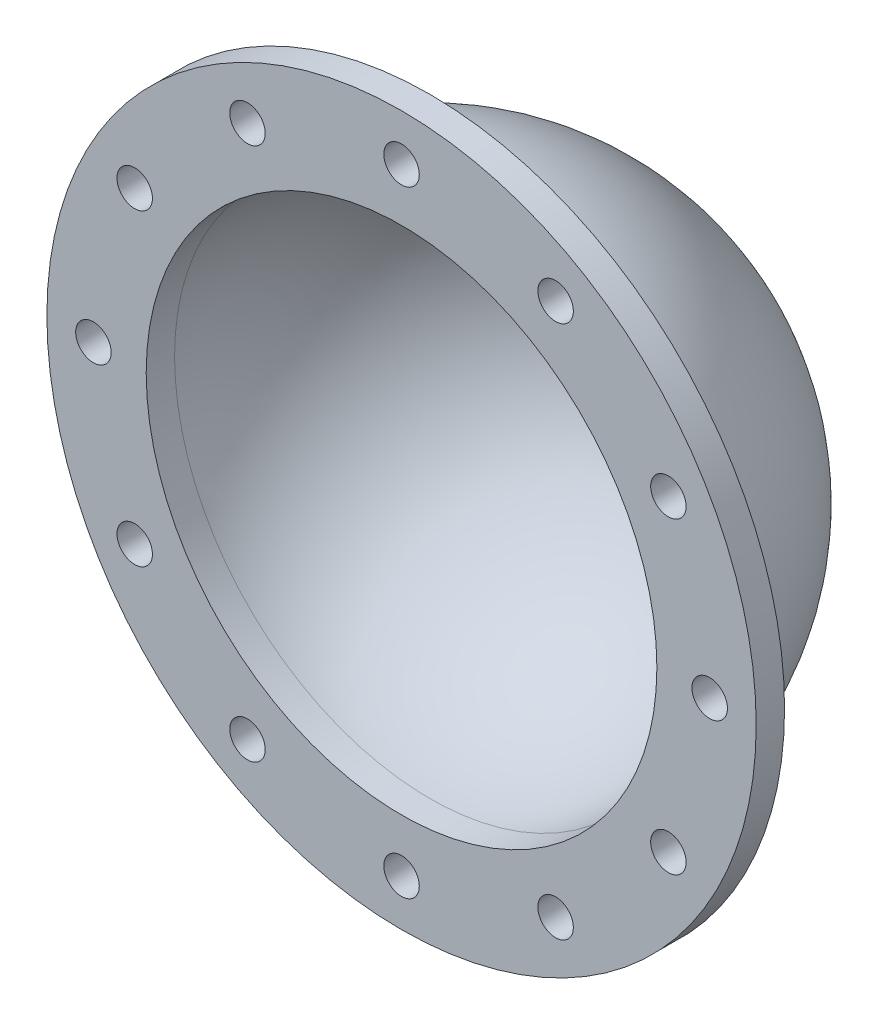
ISO-10303-21;
HEADER;
FILE_DESCRIPTION(('STEP AP214'),'2;1');
FILE_NAME('part.step','',(''),(''),'','','');
FILE_SCHEMA(('AUTOMOTIVE_DESIGN { 1 0 10303 214 1 1 1 1 }'));
ENDSEC;
DATA;
#1=APPLICATION_CONTEXT('core data for automotive mechanical design processes');
#2=APPLICATION_PROTOCOL_DEFINITION('international standard','automotive_design',2000,#1);
#3=PRODUCT_CONTEXT('',#1,'mechanical');
#4=PRODUCT('Part','Part','',(#3));
#5=PRODUCT_RELATED_PRODUCT_CATEGORY('part','',(#4));
#6=PRODUCT_DEFINITION_FORMATION('','',#4);
#7=PRODUCT_DEFINITION_CONTEXT('part definition',#1,'design');
#8=PRODUCT_DEFINITION('design','',#6,#7);
#9=PRODUCT_DEFINITION_SHAPE('','',#8);
#10=(LENGTH_UNIT() NAMED_UNIT(*) SI_UNIT(.MILLI.,.METRE.));
#11=(NAMED_UNIT(*) PLANE_ANGLE_UNIT() SI_UNIT($,.RADIAN.));
#12=(NAMED_UNIT(*) SI_UNIT($,.STERADIAN.) SOLID_ANGLE_UNIT());
#13=UNCERTAINTY_MEASURE_WITH_UNIT(LENGTH_MEASURE(1.E-05),#10,'distance_accuracy_value','');
#14=(GEOMETRIC_REPRESENTATION_CONTEXT(3) GLOBAL_UNCERTAINTY_ASSIGNED_CONTEXT((#13)) GLOBAL_UNIT_ASSIGNED_CONTEXT((#10,
#11,#12)) REPRESENTATION_CONTEXT('',''));
#15=CARTESIAN_POINT('',(0.,0.,0.));
#16=DIRECTION('',(0.,0.,1.));
#17=DIRECTION('',(1.,0.,0.));
#18=AXIS2_PLACEMENT_3D('',#15,#16,#17);
#19=CARTESIAN_POINT('',(0.,0.,20.));
#20=DIRECTION('',(0.,0.,1.));
#21=DIRECTION('',(1.,0.,0.));
#22=AXIS2_PLACEMENT_3D('',#19,#20,#21);
#23=PLANE('',#22);
#24=CARTESIAN_POINT('',(-188.100802368839,108.600048882428,20.));
#25=DIRECTION('',(0.,0.,1.));
#26=DIRECTION('',(1.,0.,0.));
#27=AXIS2_PLACEMENT_3D('',#24,#25,#26);
#28=CIRCLE('',#27,12.5000000000093);
#29=CARTESIAN_POINT('',(-175.60080236883,108.600048882428,20.));
#30=VERTEX_POINT('',#29);
#31=EDGE_CURVE('E112',#30,#30,#28,.T.);
#32=ORIENTED_EDGE('',*,*,#31,.F.);
#33=EDGE_LOOP('',(#32));
#34=FACE_BOUND('',#33,.T.);
#35=CARTESIAN_POINT('',(-188.10080236883,-108.600048882445,20.));
#36=DIRECTION('',(0.,0.,1.));
#37=DIRECTION('',(1.,0.,0.));
#38=AXIS2_PLACEMENT_3D('',#35,#36,#37);
#39=CIRCLE('',#38,12.5000000000175);
#40=CARTESIAN_POINT('',(-175.600802368812,-108.600048882445,20.));
#41=VERTEX_POINT('',#40);
#42=EDGE_CURVE('E100',#41,#41,#39,.T.);
#43=ORIENTED_EDGE('',*,*,#42,.F.);
#44=EDGE_LOOP('',(#43));
#45=FACE_BOUND('',#44,.T.);
#46=CARTESIAN_POINT('',(1.84407513919656E-11,-217.200097764873,20.));
#47=DIRECTION('',(0.,0.,1.));
#48=DIRECTION('',(1.,0.,0.));
#49=AXIS2_PLACEMENT_3D('',#46,#47,#48);
#50=CIRCLE('',#49,12.5000000000191);
#51=CARTESIAN_POINT('',(12.5000000000375,-217.200097764873,20.));
#52=VERTEX_POINT('',#51);
#53=EDGE_CURVE('E88',#52,#52,#50,.T.);
#54=ORIENTED_EDGE('',*,*,#53,.F.);
#55=EDGE_LOOP('',(#54));
#56=FACE_BOUND('',#55,.T.);
#57=CARTESIAN_POINT('',(188.100802368858,-108.600048882428,20.));
#58=DIRECTION('',(0.,0.,1.));
#59=DIRECTION('',(1.,0.,0.));
#60=AXIS2_PLACEMENT_3D('',#57,#58,#59);
#61=CIRCLE('',#60,12.5000000000119);
#62=CARTESIAN_POINT('',(200.600802368869,-108.600048882428,20.));
#63=VERTEX_POINT('',#62);
#64=EDGE_CURVE('E76',#63,#63,#61,.T.);
#65=ORIENTED_EDGE('',*,*,#64,.F.);
#66=EDGE_LOOP('',(#65));
#67=FACE_BOUND('',#66,.T.);
#68=CARTESIAN_POINT('',(188.100802368848,108.600048882445,20.));
#69=DIRECTION('',(0.,0.,1.));
#70=DIRECTION('',(1.,0.,0.));
#71=AXIS2_PLACEMENT_3D('',#68,#69,#70);
#72=CIRCLE('',#71,12.5000000000026);
#73=CARTESIAN_POINT('',(200.600802368851,108.600048882445,20.));
#74=VERTEX_POINT('',#73);
#75=EDGE_CURVE('E64',#74,#74,#72,.T.);
#76=ORIENTED_EDGE('',*,*,#75,.F.);
#77=EDGE_LOOP('',(#76));
#78=FACE_BOUND('',#77,.T.);
#79=CARTESIAN_POINT('',(0.,217.200097764873,20.));
#80=DIRECTION('',(0.,0.,1.));
#81=DIRECTION('',(1.,0.,0.));
#82=AXIS2_PLACEMENT_3D('',#79,#80,#81);
#83=CIRCLE('',#82,12.5);
#84=CARTESIAN_POINT('',(12.5,217.200097764873,20.));
#85=VERTEX_POINT('',#84);
#86=EDGE_CURVE('E52',#85,#85,#83,.T.);
#87=ORIENTED_EDGE('',*,*,#86,.F.);
#88=EDGE_LOOP('',(#87));
#89=FACE_BOUND('',#88,.T.);
#90=CARTESIAN_POINT('',(0.,0.,20.));
#91=DIRECTION('',(0.,0.,1.));
#92=DIRECTION('',(1.,0.,0.));
#93=AXIS2_PLACEMENT_3D('',#90,#91,#92);
#94=CIRCLE('',#93,250.);
#95=CARTESIAN_POINT('',(250.,0.,20.));
#96=VERTEX_POINT('',#95);
#97=EDGE_CURVE('E38',#96,#96,#94,.T.);
#98=ORIENTED_EDGE('',*,*,#97,.T.);
#99=EDGE_LOOP('',(#98));
#100=FACE_BOUND('',#99,.T.);
#101=CARTESIAN_POINT('',(0.,0.,20.));
#102=DIRECTION('',(0.,0.,1.));
#103=DIRECTION('',(1.,0.,0.));
#104=AXIS2_PLACEMENT_3D('',#101,#102,#103);
#105=CIRCLE('',#104,180.);
#106=CARTESIAN_POINT('',(180.,0.,20.));
#107=VERTEX_POINT('',#106);
#108=EDGE_CURVE('E47',#107,#107,#105,.T.);
#109=ORIENTED_EDGE('',*,*,#108,.F.);
#110=EDGE_LOOP('',(#109));
#111=FACE_BOUND('',#110,.T.);
#112=CARTESIAN_POINT('',(108.600048882437,188.100802368844,20.));
#113=DIRECTION('',(0.,0.,1.));
#114=DIRECTION('',(1.,0.,0.));
#115=AXIS2_PLACEMENT_3D('',#112,#113,#114);
#116=CIRCLE('',#115,12.5);
#117=CARTESIAN_POINT('',(121.100048882437,188.100802368844,20.));
#118=VERTEX_POINT('',#117);
#119=EDGE_CURVE('E58',#118,#118,#116,.T.);
#120=ORIENTED_EDGE('',*,*,#119,.F.);
#121=EDGE_LOOP('',(#120));
#122=FACE_BOUND('',#121,.T.);
#123=CARTESIAN_POINT('',(217.200097764882,9.21961029173334E-12,20.));
#124=DIRECTION('',(0.,0.,1.));
#125=DIRECTION('',(1.,0.,0.));
#126=AXIS2_PLACEMENT_3D('',#123,#124,#125);
#127=CIRCLE('',#126,12.5000000000068);
#128=CARTESIAN_POINT('',(229.700097764889,9.21961029173334E-12,20.));
#129=VERTEX_POINT('',#128);
#130=EDGE_CURVE('E70',#129,#129,#127,.T.);
#131=ORIENTED_EDGE('',*,*,#130,.F.);
#132=EDGE_LOOP('',(#131));
#133=FACE_BOUND('',#132,.T.);
#134=CARTESIAN_POINT('',(108.600048882454,-188.100802368839,20.));
#135=DIRECTION('',(0.,0.,1.));
#136=DIRECTION('',(1.,0.,0.));
#137=AXIS2_PLACEMENT_3D('',#134,#135,#136);
#138=CIRCLE('',#137,12.5000000000164);
#139=CARTESIAN_POINT('',(121.10004888247,-188.100802368839,20.));
#140=VERTEX_POINT('',#139);
#141=EDGE_CURVE('E82',#140,#140,#138,.T.);
#142=ORIENTED_EDGE('',*,*,#141,.F.);
#143=EDGE_LOOP('',(#142));
#144=FACE_BOUND('',#143,.T.);
#145=CARTESIAN_POINT('',(-108.600048882419,-188.100802368848,20.));
#146=DIRECTION('',(0.,0.,1.));
#147=DIRECTION('',(1.,0.,0.));
#148=AXIS2_PLACEMENT_3D('',#145,#146,#147);
#149=CIRCLE('',#148,12.5000000000195);
#150=CARTESIAN_POINT('',(-96.1000488823998,-188.100802368848,20.));
#151=VERTEX_POINT('',#150);
#152=EDGE_CURVE('E94',#151,#151,#149,.T.);
#153=ORIENTED_EDGE('',*,*,#152,.F.);
#154=EDGE_LOOP('',(#153));
#155=FACE_BOUND('',#154,.T.);
#156=CARTESIAN_POINT('',(-217.200097764864,-9.24620963218356E-12,20.));
#157=DIRECTION('',(0.,0.,1.));
#158=DIRECTION('',(1.,0.,0.));
#159=AXIS2_PLACEMENT_3D('',#156,#157,#158);
#160=CIRCLE('',#159,12.5000000000137);
#161=CARTESIAN_POINT('',(-204.70009776485,-9.24620963218356E-12,20.));
#162=VERTEX_POINT('',#161);
#163=EDGE_CURVE('E106',#162,#162,#160,.T.);
#164=ORIENTED_EDGE('',*,*,#163,.F.);
#165=EDGE_LOOP('',(#164));
#166=FACE_BOUND('',#165,.T.);
#167=CARTESIAN_POINT('',(-108.600048882435,188.100802368839,20.));
#168=DIRECTION('',(0.,0.,1.));
#169=DIRECTION('',(1.,0.,0.));
#170=AXIS2_PLACEMENT_3D('',#167,#168,#169);
#171=CIRCLE('',#170,12.5000000000053);
#172=CARTESIAN_POINT('',(-96.1000488824301,188.100802368839,20.));
#173=VERTEX_POINT('',#172);
#174=EDGE_CURVE('E118',#173,#173,#171,.T.);
#175=ORIENTED_EDGE('',*,*,#174,.F.);
#176=EDGE_LOOP('',(#175));
#177=FACE_BOUND('',#176,.T.);
#178=ADVANCED_FACE('F31',(#34,#45,#56,#67,#78,#89,#100,#111,#122,#133,#144,#155,#166,#177),#23,.T.);
#179=CARTESIAN_POINT('',(0.,0.,0.));
#180=DIRECTION('',(0.,0.,1.));
#181=DIRECTION('',(1.,0.,0.));
#182=AXIS2_PLACEMENT_3D('',#179,#180,#181);
#183=PLANE('',#182);
#184=CARTESIAN_POINT('',(0.,0.,0.));
#185=DIRECTION('',(0.,0.,1.));
#186=DIRECTION('',(1.,0.,0.));
#187=AXIS2_PLACEMENT_3D('',#184,#185,#186);
#188=CIRCLE('',#187,200.);
#189=CARTESIAN_POINT('',(200.,0.,0.));
#190=VERTEX_POINT('',#189);
#191=EDGE_CURVE('E10',#190,#190,#188,.F.);
#192=ORIENTED_EDGE('',*,*,#191,.F.);
#193=EDGE_LOOP('',(#192));
#194=FACE_BOUND('',#193,.T.);
#195=CARTESIAN_POINT('',(0.,0.,0.));
#196=DIRECTION('',(0.,0.,1.));
#197=DIRECTION('',(1.,0.,0.));
#198=AXIS2_PLACEMENT_3D('',#195,#196,#197);
#199=CIRCLE('',#198,250.);
#200=CARTESIAN_POINT('',(250.,0.,0.));
#201=VERTEX_POINT('',#200);
#202=EDGE_CURVE('E42',#201,#201,#199,.T.);
#203=ORIENTED_EDGE('',*,*,#202,.F.);
#204=EDGE_LOOP('',(#203));
#205=FACE_BOUND('',#204,.T.);
#206=CARTESIAN_POINT('',(0.,217.200097764873,0.));
#207=DIRECTION('',(0.,0.,1.));
#208=DIRECTION('',(1.,0.,0.));
#209=AXIS2_PLACEMENT_3D('',#206,#207,#208);
#210=CIRCLE('',#209,12.5);
#211=CARTESIAN_POINT('',(12.5,217.200097764873,0.));
#212=VERTEX_POINT('',#211);
#213=EDGE_CURVE('E55',#212,#212,#210,.T.);
#214=ORIENTED_EDGE('',*,*,#213,.T.);
#215=EDGE_LOOP('',(#214));
#216=FACE_BOUND('',#215,.T.);
#217=CARTESIAN_POINT('',(108.600048882437,188.100802368844,0.));
#218=DIRECTION('',(0.,0.,1.));
#219=DIRECTION('',(1.,0.,0.));
#220=AXIS2_PLACEMENT_3D('',#217,#218,#219);
#221=CIRCLE('',#220,12.5);
#222=CARTESIAN_POINT('',(121.100048882437,188.100802368844,0.));
#223=VERTEX_POINT('',#222);
#224=EDGE_CURVE('E61',#223,#223,#221,.T.);
#225=ORIENTED_EDGE('',*,*,#224,.T.);
#226=EDGE_LOOP('',(#225));
#227=FACE_BOUND('',#226,.T.);
#228=CARTESIAN_POINT('',(188.100802368848,108.600048882445,0.));
#229=DIRECTION('',(0.,0.,1.));
#230=DIRECTION('',(1.,0.,0.));
#231=AXIS2_PLACEMENT_3D('',#228,#229,#230);
#232=CIRCLE('',#231,12.5000000000026);
#233=CARTESIAN_POINT('',(200.600802368851,108.600048882445,0.));
#234=VERTEX_POINT('',#233);
#235=EDGE_CURVE('E67',#234,#234,#232,.T.);
#236=ORIENTED_EDGE('',*,*,#235,.T.);
#237=EDGE_LOOP('',(#236));
#238=FACE_BOUND('',#237,.T.);
#239=CARTESIAN_POINT('',(217.200097764882,9.21961029173334E-12,0.));
#240=DIRECTION('',(0.,0.,1.));
#241=DIRECTION('',(1.,0.,0.));
#242=AXIS2_PLACEMENT_3D('',#239,#240,#241);
#243=CIRCLE('',#242,12.5000000000068);
#244=CARTESIAN_POINT('',(229.700097764889,9.21961029173334E-12,0.));
#245=VERTEX_POINT('',#244);
#246=EDGE_CURVE('E73',#245,#245,#243,.T.);
#247=ORIENTED_EDGE('',*,*,#246,.T.);
#248=EDGE_LOOP('',(#247));
#249=FACE_BOUND('',#248,.T.);
#250=CARTESIAN_POINT('',(188.100802368858,-108.600048882428,0.));
#251=DIRECTION('',(0.,0.,1.));
#252=DIRECTION('',(1.,0.,0.));
#253=AXIS2_PLACEMENT_3D('',#250,#251,#252);
#254=CIRCLE('',#253,12.5000000000119);
#255=CARTESIAN_POINT('',(200.600802368869,-108.600048882428,0.));
#256=VERTEX_POINT('',#255);
#257=EDGE_CURVE('E79',#256,#256,#254,.T.);
#258=ORIENTED_EDGE('',*,*,#257,.T.);
#259=EDGE_LOOP('',(#258));
#260=FACE_BOUND('',#259,.T.);
#261=CARTESIAN_POINT('',(108.600048882454,-188.100802368839,0.));
#262=DIRECTION('',(0.,0.,1.));
#263=DIRECTION('',(1.,0.,0.));
#264=AXIS2_PLACEMENT_3D('',#261,#262,#263);
#265=CIRCLE('',#264,12.5000000000164);
#266=CARTESIAN_POINT('',(121.10004888247,-188.100802368839,0.));
#267=VERTEX_POINT('',#266);
#268=EDGE_CURVE('E85',#267,#267,#265,.T.);
#269=ORIENTED_EDGE('',*,*,#268,.T.);
#270=EDGE_LOOP('',(#269));
#271=FACE_BOUND('',#270,.T.);
#272=CARTESIAN_POINT('',(1.84407513919656E-11,-217.200097764873,0.));
#273=DIRECTION('',(0.,0.,1.));
#274=DIRECTION('',(1.,0.,0.));
#275=AXIS2_PLACEMENT_3D('',#272,#273,#274);
#276=CIRCLE('',#275,12.5000000000191);
#277=CARTESIAN_POINT('',(12.5000000000375,-217.200097764873,0.));
#278=VERTEX_POINT('',#277);
#279=EDGE_CURVE('E91',#278,#278,#276,.T.);
#280=ORIENTED_EDGE('',*,*,#279,.T.);
#281=EDGE_LOOP('',(#280));
#282=FACE_BOUND('',#281,.T.);
#283=CARTESIAN_POINT('',(-108.600048882419,-188.100802368848,0.));
#284=DIRECTION('',(0.,0.,1.));
#285=DIRECTION('',(1.,0.,0.));
#286=AXIS2_PLACEMENT_3D('',#283,#284,#285);
#287=CIRCLE('',#286,12.5000000000195);
#288=CARTESIAN_POINT('',(-96.1000488823998,-188.100802368848,0.));
#289=VERTEX_POINT('',#288);
#290=EDGE_CURVE('E97',#289,#289,#287,.T.);
#291=ORIENTED_EDGE('',*,*,#290,.T.);
#292=EDGE_LOOP('',(#291));
#293=FACE_BOUND('',#292,.T.);
#294=CARTESIAN_POINT('',(-188.10080236883,-108.600048882445,0.));
#295=DIRECTION('',(0.,0.,1.));
#296=DIRECTION('',(1.,0.,0.));
#297=AXIS2_PLACEMENT_3D('',#294,#295,#296);
#298=CIRCLE('',#297,12.5000000000175);
#299=CARTESIAN_POINT('',(-175.600802368812,-108.600048882445,0.));
#300=VERTEX_POINT('',#299);
#301=EDGE_CURVE('E103',#300,#300,#298,.T.);
#302=ORIENTED_EDGE('',*,*,#301,.T.);
#303=EDGE_LOOP('',(#302));
#304=FACE_BOUND('',#303,.T.);
#305=CARTESIAN_POINT('',(-217.200097764864,-9.24620963218356E-12,0.));
#306=DIRECTION('',(0.,0.,1.));
#307=DIRECTION('',(1.,0.,0.));
#308=AXIS2_PLACEMENT_3D('',#305,#306,#307);
#309=CIRCLE('',#308,12.5000000000137);
#310=CARTESIAN_POINT('',(-204.70009776485,-9.24620963218356E-12,0.));
#311=VERTEX_POINT('',#310);
#312=EDGE_CURVE('E109',#311,#311,#309,.T.);
#313=ORIENTED_EDGE('',*,*,#312,.T.);
#314=EDGE_LOOP('',(#313));
#315=FACE_BOUND('',#314,.T.);
#316=CARTESIAN_POINT('',(-188.100802368839,108.600048882428,0.));
#317=DIRECTION('',(0.,0.,1.));
#318=DIRECTION('',(1.,0.,0.));
#319=AXIS2_PLACEMENT_3D('',#316,#317,#318);
#320=CIRCLE('',#319,12.5000000000093);
#321=CARTESIAN_POINT('',(-175.60080236883,108.600048882428,0.));
#322=VERTEX_POINT('',#321);
#323=EDGE_CURVE('E115',#322,#322,#320,.T.);
#324=ORIENTED_EDGE('',*,*,#323,.T.);
#325=EDGE_LOOP('',(#324));
#326=FACE_BOUND('',#325,.T.);
#327=CARTESIAN_POINT('',(-108.600048882435,188.100802368839,0.));
#328=DIRECTION('',(0.,0.,1.));
#329=DIRECTION('',(1.,0.,0.));
#330=AXIS2_PLACEMENT_3D('',#327,#328,#329);
#331=CIRCLE('',#330,12.5000000000053);
#332=CARTESIAN_POINT('',(-96.1000488824301,188.100802368839,0.));
#333=VERTEX_POINT('',#332);
#334=EDGE_CURVE('E121',#333,#333,#331,.T.);
#335=ORIENTED_EDGE('',*,*,#334,.T.);
#336=EDGE_LOOP('',(#335));
#337=FACE_BOUND('',#336,.T.);
#338=ADVANCED_FACE('F131',(#194,#205,#216,#227,#238,#249,#260,#271,#282,#293,#304,#315,#326,
#337),#183,.F.);
#339=CARTESIAN_POINT('',(0.,0.,20.));
#340=DIRECTION('',(0.,0.,-1.));
#341=DIRECTION('',(-1.,0.,0.));
#342=AXIS2_PLACEMENT_3D('',#339,#340,#341);
#343=CYLINDRICAL_SURFACE('',#342,250.);
#344=ORIENTED_EDGE('',*,*,#97,.F.);
#345=EDGE_LOOP('',(#344));
#346=FACE_BOUND('',#345,.T.);
#347=ORIENTED_EDGE('',*,*,#202,.T.);
#348=EDGE_LOOP('',(#347));
#349=FACE_BOUND('',#348,.T.);
#350=ADVANCED_FACE('F33',(#346,#349),#343,.T.);
#351=CARTESIAN_POINT('',(0.,0.,20.));
#352=DIRECTION('',(0.,0.,-1.));
#353=DIRECTION('',(-1.,0.,0.));
#354=AXIS2_PLACEMENT_3D('',#351,#352,#353);
#355=CYLINDRICAL_SURFACE('',#354,180.);
#356=ORIENTED_EDGE('',*,*,#108,.T.);
#357=EDGE_LOOP('',(#356));
#358=FACE_BOUND('',#357,.T.);
#359=CARTESIAN_POINT('',(0.,0.,0.));
#360=DIRECTION('',(0.,0.,1.));
#361=DIRECTION('',(1.,0.,0.));
#362=AXIS2_PLACEMENT_3D('',#359,#360,#361);
#363=CIRCLE('',#362,180.);
#364=CARTESIAN_POINT('',(180.,0.,0.));
#365=VERTEX_POINT('',#364);
#366=EDGE_CURVE('E49',#365,#365,#363,.T.);
#367=ORIENTED_EDGE('',*,*,#366,.F.);
#368=EDGE_LOOP('',(#367));
#369=FACE_BOUND('',#368,.T.);
#370=ADVANCED_FACE('F141',(#358,#369),#355,.F.);
#371=CARTESIAN_POINT('',(0.,217.200097764873,20.));
#372=DIRECTION('',(0.,0.,-1.));
#373=DIRECTION('',(-1.,0.,0.));
#374=AXIS2_PLACEMENT_3D('',#371,#372,#373);
#375=CYLINDRICAL_SURFACE('',#374,12.5);
#376=ORIENTED_EDGE('',*,*,#86,.T.);
#377=EDGE_LOOP('',(#376));
#378=FACE_BOUND('',#377,.T.);
#379=ORIENTED_EDGE('',*,*,#213,.F.);
#380=EDGE_LOOP('',(#379));
#381=FACE_BOUND('',#380,.T.);
#382=ADVANCED_FACE('F144',(#378,#381),#375,.F.);
#383=CARTESIAN_POINT('',(108.600048882437,188.100802368844,20.));
#384=DIRECTION('',(0.,0.,-1.));
#385=DIRECTION('',(-1.,0.,0.));
#386=AXIS2_PLACEMENT_3D('',#383,#384,#385);
#387=CYLINDRICAL_SURFACE('',#386,12.5);
#388=ORIENTED_EDGE('',*,*,#119,.T.);
#389=EDGE_LOOP('',(#388));
#390=FACE_BOUND('',#389,.T.);
#391=ORIENTED_EDGE('',*,*,#224,.F.);
#392=EDGE_LOOP('',(#391));
#393=FACE_BOUND('',#392,.T.);
#394=ADVANCED_FACE('F148',(#390,#393),#387,.F.);
#395=CARTESIAN_POINT('',(188.100802368848,108.600048882445,20.));
#396=DIRECTION('',(0.,0.,-1.));
#397=DIRECTION('',(-1.,0.,0.));
#398=AXIS2_PLACEMENT_3D('',#395,#396,#397);
#399=CYLINDRICAL_SURFACE('',#398,12.5000000000026);
#400=ORIENTED_EDGE('',*,*,#75,.T.);
#401=EDGE_LOOP('',(#400));
#402=FACE_BOUND('',#401,.T.);
#403=ORIENTED_EDGE('',*,*,#235,.F.);
#404=EDGE_LOOP('',(#403));
#405=FACE_BOUND('',#404,.T.);
#406=ADVANCED_FACE('F152',(#402,#405),#399,.F.);
#407=CARTESIAN_POINT('',(217.200097764882,9.21961029173334E-12,20.));
#408=DIRECTION('',(0.,0.,-1.));
#409=DIRECTION('',(-1.,0.,0.));
#410=AXIS2_PLACEMENT_3D('',#407,#408,#409);
#411=CYLINDRICAL_SURFACE('',#410,12.5000000000068);
#412=ORIENTED_EDGE('',*,*,#130,.T.);
#413=EDGE_LOOP('',(#412));
#414=FACE_BOUND('',#413,.T.);
#415=ORIENTED_EDGE('',*,*,#246,.F.);
#416=EDGE_LOOP('',(#415));
#417=FACE_BOUND('',#416,.T.);
#418=ADVANCED_FACE('F156',(#414,#417),#411,.F.);
#419=CARTESIAN_POINT('',(188.100802368858,-108.600048882428,20.));
#420=DIRECTION('',(0.,0.,-1.));
#421=DIRECTION('',(-1.,0.,0.));
#422=AXIS2_PLACEMENT_3D('',#419,#420,#421);
#423=CYLINDRICAL_SURFACE('',#422,12.5000000000119);
#424=ORIENTED_EDGE('',*,*,#64,.T.);
#425=EDGE_LOOP('',(#424));
#426=FACE_BOUND('',#425,.T.);
#427=ORIENTED_EDGE('',*,*,#257,.F.);
#428=EDGE_LOOP('',(#427));
#429=FACE_BOUND('',#428,.T.);
#430=ADVANCED_FACE('F160',(#426,#429),#423,.F.);
#431=CARTESIAN_POINT('',(108.600048882454,-188.100802368839,20.));
#432=DIRECTION('',(0.,0.,-1.));
#433=DIRECTION('',(-1.,0.,0.));
#434=AXIS2_PLACEMENT_3D('',#431,#432,#433);
#435=CYLINDRICAL_SURFACE('',#434,12.5000000000164);
#436=ORIENTED_EDGE('',*,*,#141,.T.);
#437=EDGE_LOOP('',(#436));
#438=FACE_BOUND('',#437,.T.);
#439=ORIENTED_EDGE('',*,*,#268,.F.);
#440=EDGE_LOOP('',(#439));
#441=FACE_BOUND('',#440,.T.);
#442=ADVANCED_FACE('F164',(#438,#441),#435,.F.);
#443=CARTESIAN_POINT('',(1.84407513919656E-11,-217.200097764873,20.));
#444=DIRECTION('',(0.,0.,-1.));
#445=DIRECTION('',(-1.,0.,0.));
#446=AXIS2_PLACEMENT_3D('',#443,#444,#445);
#447=CYLINDRICAL_SURFACE('',#446,12.5000000000191);
#448=ORIENTED_EDGE('',*,*,#53,.T.);
#449=EDGE_LOOP('',(#448));
#450=FACE_BOUND('',#449,.T.);
#451=ORIENTED_EDGE('',*,*,#279,.F.);
#452=EDGE_LOOP('',(#451));
#453=FACE_BOUND('',#452,.T.);
#454=ADVANCED_FACE('F168',(#450,#453),#447,.F.);
#455=CARTESIAN_POINT('',(-108.600048882419,-188.100802368848,20.));
#456=DIRECTION('',(0.,0.,-1.));
#457=DIRECTION('',(-1.,0.,0.));
#458=AXIS2_PLACEMENT_3D('',#455,#456,#457);
#459=CYLINDRICAL_SURFACE('',#458,12.5000000000195);
#460=ORIENTED_EDGE('',*,*,#152,.T.);
#461=EDGE_LOOP('',(#460));
#462=FACE_BOUND('',#461,.T.);
#463=ORIENTED_EDGE('',*,*,#290,.F.);
#464=EDGE_LOOP('',(#463));
#465=FACE_BOUND('',#464,.T.);
#466=ADVANCED_FACE('F172',(#462,#465),#459,.F.);
#467=CARTESIAN_POINT('',(-188.10080236883,-108.600048882445,20.));
#468=DIRECTION('',(0.,0.,-1.));
#469=DIRECTION('',(-1.,0.,0.));
#470=AXIS2_PLACEMENT_3D('',#467,#468,#469);
#471=CYLINDRICAL_SURFACE('',#470,12.5000000000175);
#472=ORIENTED_EDGE('',*,*,#42,.T.);
#473=EDGE_LOOP('',(#472));
#474=FACE_BOUND('',#473,.T.);
#475=ORIENTED_EDGE('',*,*,#301,.F.);
#476=EDGE_LOOP('',(#475));
#477=FACE_BOUND('',#476,.T.);
#478=ADVANCED_FACE('F176',(#474,#477),#471,.F.);
#479=CARTESIAN_POINT('',(-217.200097764864,-9.24620963218356E-12,20.));
#480=DIRECTION('',(0.,0.,-1.));
#481=DIRECTION('',(-1.,0.,0.));
#482=AXIS2_PLACEMENT_3D('',#479,#480,#481);
#483=CYLINDRICAL_SURFACE('',#482,12.5000000000137);
#484=ORIENTED_EDGE('',*,*,#163,.T.);
#485=EDGE_LOOP('',(#484));
#486=FACE_BOUND('',#485,.T.);
#487=ORIENTED_EDGE('',*,*,#312,.F.);
#488=EDGE_LOOP('',(#487));
#489=FACE_BOUND('',#488,.T.);
#490=ADVANCED_FACE('F180',(#486,#489),#483,.F.);
#491=CARTESIAN_POINT('',(-188.100802368839,108.600048882428,20.));
#492=DIRECTION('',(0.,0.,-1.));
#493=DIRECTION('',(-1.,0.,0.));
#494=AXIS2_PLACEMENT_3D('',#491,#492,#493);
#495=CYLINDRICAL_SURFACE('',#494,12.5000000000093);
#496=ORIENTED_EDGE('',*,*,#31,.T.);
#497=EDGE_LOOP('',(#496));
#498=FACE_BOUND('',#497,.T.);
#499=ORIENTED_EDGE('',*,*,#323,.F.);
#500=EDGE_LOOP('',(#499));
#501=FACE_BOUND('',#500,.T.);
#502=ADVANCED_FACE('F184',(#498,#501),#495,.F.);
#503=CARTESIAN_POINT('',(-108.600048882435,188.100802368839,20.));
#504=DIRECTION('',(0.,0.,-1.));
#505=DIRECTION('',(-1.,0.,0.));
#506=AXIS2_PLACEMENT_3D('',#503,#504,#505);
#507=CYLINDRICAL_SURFACE('',#506,12.5000000000053);
#508=ORIENTED_EDGE('',*,*,#174,.T.);
#509=EDGE_LOOP('',(#508));
#510=FACE_BOUND('',#509,.T.);
#511=ORIENTED_EDGE('',*,*,#334,.F.);
#512=EDGE_LOOP('',(#511));
#513=FACE_BOUND('',#512,.T.);
#514=ADVANCED_FACE('F127',(#510,#513),#507,.F.);
#515=CARTESIAN_POINT('',(0.,0.,0.));
#516=DIRECTION('',(0.,1.,0.));
#517=DIRECTION('',(-1.,0.,0.));
#518=AXIS2_PLACEMENT_3D('',#515,#516,#517);
#519=SPHERICAL_SURFACE('',#518,180.);
#520=CARTESIAN_POINT('',(0.,0.,0.));
#521=DIRECTION('',(0.,0.,1.));
#522=DIRECTION('',(1.,0.,0.));
#523=AXIS2_PLACEMENT_3D('',#520,#521,#522);
#524=SPHERICAL_SURFACE('',#523,180.);
#525=ORIENTED_EDGE('',*,*,#366,.T.);
#526=EDGE_LOOP('',(#525));
#527=FACE_BOUND('',#526,.T.);
#528=ADVANCED_FACE('F191',(#527),#524,.F.);
#529=CARTESIAN_POINT('',(0.,0.,0.));
#530=DIRECTION('',(0.,1.,0.));
#531=DIRECTION('',(-1.,0.,0.));
#532=AXIS2_PLACEMENT_3D('',#529,#530,#531);
#533=SPHERICAL_SURFACE('',#532,200.);
#534=CARTESIAN_POINT('',(0.,0.,0.));
#535=DIRECTION('',(0.,0.,1.));
#536=DIRECTION('',(1.,0.,0.));
#537=AXIS2_PLACEMENT_3D('',#534,#535,#536);
#538=SPHERICAL_SURFACE('',#537,200.);
#539=ORIENTED_EDGE('',*,*,#191,.T.);
#540=EDGE_LOOP('',(#539));
#541=FACE_BOUND('',#540,.T.);
#542=ADVANCED_FACE('F192',(#541),#538,.T.);
#543=CLOSED_SHELL('',(#178,#338,#350,#370,#382,#394,#406,#418,#430,#442,#454,#466,#478,#490,
#502,#514,#528,#542));
#544=MANIFOLD_SOLID_BREP('B2',#543);
#545=ADVANCED_BREP_SHAPE_REPRESENTATION('',(#18,#544),#14);
#546=SHAPE_DEFINITION_REPRESENTATION(#9,#545);
ENDSEC;
END-ISO-10303-21;
